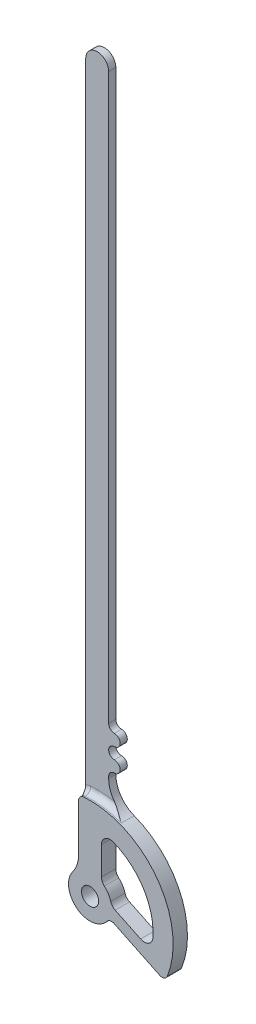
ISO-10303-21;
HEADER;
FILE_DESCRIPTION(('STEP AP214'),'2;1');
FILE_NAME('part.step','',(''),(''),'','','');
FILE_SCHEMA(('AUTOMOTIVE_DESIGN { 1 0 10303 214 1 1 1 1 }'));
ENDSEC;
DATA;
#1=APPLICATION_CONTEXT('core data for automotive mechanical design processes');
#2=APPLICATION_PROTOCOL_DEFINITION('international standard','automotive_design',2000,#1);
#3=PRODUCT_CONTEXT('',#1,'mechanical');
#4=PRODUCT('Part','Part','',(#3));
#5=PRODUCT_RELATED_PRODUCT_CATEGORY('part','',(#4));
#6=PRODUCT_DEFINITION_FORMATION('','',#4);
#7=PRODUCT_DEFINITION_CONTEXT('part definition',#1,'design');
#8=PRODUCT_DEFINITION('design','',#6,#7);
#9=PRODUCT_DEFINITION_SHAPE('','',#8);
#10=(LENGTH_UNIT() NAMED_UNIT(*) SI_UNIT(.MILLI.,.METRE.));
#11=(NAMED_UNIT(*) PLANE_ANGLE_UNIT() SI_UNIT($,.RADIAN.));
#12=(NAMED_UNIT(*) SI_UNIT($,.STERADIAN.) SOLID_ANGLE_UNIT());
#13=UNCERTAINTY_MEASURE_WITH_UNIT(LENGTH_MEASURE(1.E-05),#10,'distance_accuracy_value','');
#14=(GEOMETRIC_REPRESENTATION_CONTEXT(3) GLOBAL_UNCERTAINTY_ASSIGNED_CONTEXT((#13)) GLOBAL_UNIT_ASSIGNED_CONTEXT((#10,
#11,#12)) REPRESENTATION_CONTEXT('',''));
#15=CARTESIAN_POINT('',(0.,0.,0.));
#16=DIRECTION('',(0.,0.,1.));
#17=DIRECTION('',(1.,0.,0.));
#18=AXIS2_PLACEMENT_3D('',#15,#16,#17);
#19=CARTESIAN_POINT('',(4.,0.,247.784889177542));
#20=DIRECTION('',(1.,0.,0.));
#21=DIRECTION('',(0.,0.,1.));
#22=AXIS2_PLACEMENT_3D('',#19,#20,#21);
#23=PLANE('',#22);
#24=DIRECTION('',(0.,-1.,0.));
#25=VECTOR('',#24,1.);
#26=CARTESIAN_POINT('',(4.,0.,-2.5));
#27=LINE('',#26,#25);
#28=CARTESIAN_POINT('',(4.,37.,-2.5));
#29=VERTEX_POINT('',#28);
#30=CARTESIAN_POINT('',(4.,36.4005494464036,-2.5));
#31=VERTEX_POINT('',#30);
#32=EDGE_CURVE('E241',#29,#31,#27,.T.);
#33=ORIENTED_EDGE('',*,*,#32,.T.);
#34=DIRECTION('',(0.,0.,1.));
#35=VECTOR('',#34,1.);
#36=CARTESIAN_POINT('',(4.,36.4005494464036,247.784889177542));
#37=LINE('',#36,#35);
#38=CARTESIAN_POINT('',(4.,36.4005494464036,-5.));
#39=VERTEX_POINT('',#38);
#40=EDGE_CURVE('E344',#39,#31,#37,.T.);
#41=ORIENTED_EDGE('',*,*,#40,.F.);
#42=DIRECTION('',(0.,1.,0.));
#43=VECTOR('',#42,1.);
#44=CARTESIAN_POINT('',(4.,0.,-5.));
#45=LINE('',#44,#43);
#46=CARTESIAN_POINT('',(4.,37.,-5.));
#47=VERTEX_POINT('',#46);
#48=EDGE_CURVE('E285',#39,#47,#45,.T.);
#49=ORIENTED_EDGE('',*,*,#48,.T.);
#50=DIRECTION('',(0.,0.,-1.));
#51=VECTOR('',#50,1.);
#52=CARTESIAN_POINT('',(4.,37.,247.784889177542));
#53=LINE('',#52,#51);
#54=EDGE_CURVE('E871',#29,#47,#53,.T.);
#55=ORIENTED_EDGE('',*,*,#54,.F.);
#56=EDGE_LOOP('',(#33,#41,#49,#55));
#57=FACE_BOUND('',#56,.T.);
#58=ADVANCED_FACE('F45',(#57),#23,.T.);
#59=CARTESIAN_POINT('',(4.,53.,-5.));
#60=VERTEX_POINT('',#59);
#61=CARTESIAN_POINT('',(4.,250.,-5.));
#62=VERTEX_POINT('',#61);
#63=EDGE_CURVE('E269',#60,#62,#45,.T.);
#64=ORIENTED_EDGE('',*,*,#63,.T.);
#65=DIRECTION('',(0.,0.,-1.));
#66=VECTOR('',#65,1.);
#67=CARTESIAN_POINT('',(4.,250.,247.784889177542));
#68=LINE('',#67,#66);
#69=CARTESIAN_POINT('',(4.,250.,-2.5));
#70=VERTEX_POINT('',#69);
#71=EDGE_CURVE('E293',#70,#62,#68,.T.);
#72=ORIENTED_EDGE('',*,*,#71,.F.);
#73=CARTESIAN_POINT('',(4.,53.,-2.5));
#74=VERTEX_POINT('',#73);
#75=EDGE_CURVE('E247',#70,#74,#27,.T.);
#76=ORIENTED_EDGE('',*,*,#75,.T.);
#77=DIRECTION('',(0.,0.,-1.));
#78=VECTOR('',#77,1.);
#79=CARTESIAN_POINT('',(4.,53.,247.784889177542));
#80=LINE('',#79,#78);
#81=EDGE_CURVE('E826',#60,#74,#80,.F.);
#82=ORIENTED_EDGE('',*,*,#81,.F.);
#83=EDGE_LOOP('',(#64,#72,#76,#82));
#84=FACE_BOUND('',#83,.T.);
#85=ADVANCED_FACE('F451',(#84),#23,.T.);
#86=CARTESIAN_POINT('',(2.69287587756797E-12,0.,0.));
#87=DIRECTION('',(0.,0.,-1.));
#88=DIRECTION('',(1.,0.,0.));
#89=AXIS2_PLACEMENT_3D('',#86,#87,#88);
#90=PLANE('',#89);
#91=CARTESIAN_POINT('',(0.,0.,0.));
#92=DIRECTION('',(0.,0.,1.));
#93=DIRECTION('',(1.,0.,0.));
#94=AXIS2_PLACEMENT_3D('',#91,#92,#93);
#95=CIRCLE('',#94,7.5);
#96=CARTESIAN_POINT('',(7.20644694761719,2.07776860867107,0.));
#97=VERTEX_POINT('',#96);
#98=CARTESIAN_POINT('',(5.,5.59016994374947,0.));
#99=VERTEX_POINT('',#98);
#100=EDGE_CURVE('E266',#97,#99,#95,.T.);
#101=ORIENTED_EDGE('',*,*,#100,.T.);
#102=CARTESIAN_POINT('',(7.,7.82623792124926,0.));
#103=DIRECTION('',(0.,0.,1.));
#104=DIRECTION('',(1.,0.,0.));
#105=AXIS2_PLACEMENT_3D('',#102,#103,#104);
#106=CIRCLE('',#105,3.);
#107=CARTESIAN_POINT('',(4.,7.82623792124926,0.));
#108=VERTEX_POINT('',#107);
#109=EDGE_CURVE('E376',#108,#99,#106,.T.);
#110=ORIENTED_EDGE('',*,*,#109,.F.);
#111=DIRECTION('',(0.,1.,0.));
#112=VECTOR('',#111,1.);
#113=CARTESIAN_POINT('',(4.,0.,0.));
#114=LINE('',#113,#112);
#115=CARTESIAN_POINT('',(4.,17.6635217326557,0.));
#116=VERTEX_POINT('',#115);
#117=EDGE_CURVE('E263',#108,#116,#114,.T.);
#118=ORIENTED_EDGE('',*,*,#117,.T.);
#119=CARTESIAN_POINT('',(7.,17.6635217326557,0.));
#120=DIRECTION('',(0.,0.,1.));
#121=DIRECTION('',(1.,0.,0.));
#122=AXIS2_PLACEMENT_3D('',#119,#120,#121);
#123=CIRCLE('',#122,3.);
#124=CARTESIAN_POINT('',(8.10526315789474,20.4524988483382,0.));
#125=VERTEX_POINT('',#124);
#126=EDGE_CURVE('E394',#125,#116,#123,.T.);
#127=ORIENTED_EDGE('',*,*,#126,.F.);
#128=CARTESIAN_POINT('',(0.,0.,0.));
#129=DIRECTION('',(0.,0.,1.));
#130=DIRECTION('',(1.,0.,0.));
#131=AXIS2_PLACEMENT_3D('',#128,#129,#130);
#132=CIRCLE('',#131,22.);
#133=CARTESIAN_POINT('',(21.9434589485245,-1.57626437326332,0.));
#134=VERTEX_POINT('',#133);
#135=EDGE_CURVE('E259',#134,#125,#132,.T.);
#136=ORIENTED_EDGE('',*,*,#135,.F.);
#137=CARTESIAN_POINT('',(18.9511690919075,-1.36131923145469,0.));
#138=DIRECTION('',(0.,0.,1.));
#139=DIRECTION('',(1.,0.,0.));
#140=AXIS2_PLACEMENT_3D('',#137,#138,#139);
#141=CIRCLE('',#140,3.);
#142=CARTESIAN_POINT('',(17.6489208192768,-4.06393822724936,0.));
#143=VERTEX_POINT('',#142);
#144=EDGE_CURVE('E382',#143,#134,#141,.T.);
#145=ORIENTED_EDGE('',*,*,#144,.F.);
#146=DIRECTION('',(0.900872998598224,-0.434082757543587,0.));
#147=VECTOR('',#146,1.);
#148=CARTESIAN_POINT('',(1.73633103017435,3.6034919943929,0.));
#149=LINE('',#148,#147);
#150=CARTESIAN_POINT('',(8.7867774540333,0.206257056344831,0.));
#151=VERTEX_POINT('',#150);
#152=EDGE_CURVE('E256',#151,#143,#149,.T.);
#153=ORIENTED_EDGE('',*,*,#152,.F.);
#154=CARTESIAN_POINT('',(10.0890257266641,2.9088760521395,0.));
#155=DIRECTION('',(0.,0.,1.));
#156=DIRECTION('',(1.,0.,0.));
#157=AXIS2_PLACEMENT_3D('',#154,#155,#156);
#158=CIRCLE('',#157,3.);
#159=EDGE_CURVE('E388',#97,#151,#158,.T.);
#160=ORIENTED_EDGE('',*,*,#159,.F.);
#161=EDGE_LOOP('',(#101,#110,#118,#127,#136,#145,#153,#160));
#162=FACE_BOUND('',#161,.T.);
#163=CARTESIAN_POINT('',(2.69287587756797E-12,0.,0.));
#164=DIRECTION('',(0.,0.,1.));
#165=DIRECTION('',(1.,0.,0.));
#166=AXIS2_PLACEMENT_3D('',#163,#164,#165);
#167=CIRCLE('',#166,2.99999999999804);
#168=CARTESIAN_POINT('',(3.00000000000073,0.,0.));
#169=VERTEX_POINT('',#168);
#170=EDGE_CURVE('E283',#169,#169,#167,.T.);
#171=ORIENTED_EDGE('',*,*,#170,.F.);
#172=EDGE_LOOP('',(#171));
#173=FACE_BOUND('',#172,.T.);
#174=DIRECTION('',(0.,-1.,0.));
#175=VECTOR('',#174,1.);
#176=CARTESIAN_POINT('',(-4.,0.,0.));
#177=LINE('',#176,#175);
#178=CARTESIAN_POINT('',(-4.,26.9258240356723,0.));
#179=VERTEX_POINT('',#178);
#180=CARTESIAN_POINT('',(-4.,10.4999999999964,0.));
#181=VERTEX_POINT('',#180);
#182=EDGE_CURVE('E280',#179,#181,#177,.T.);
#183=ORIENTED_EDGE('',*,*,#182,.T.);
#184=CARTESIAN_POINT('',(-14.,10.4999999999964,0.));
#185=DIRECTION('',(0.,0.,1.));
#186=DIRECTION('',(1.,0.,0.));
#187=AXIS2_PLACEMENT_3D('',#184,#185,#186);
#188=CIRCLE('',#187,10.);
#189=CARTESIAN_POINT('',(-5.99999999999846,4.49999999999846,0.));
#190=VERTEX_POINT('',#189);
#191=EDGE_CURVE('E354',#190,#181,#188,.T.);
#192=ORIENTED_EDGE('',*,*,#191,.F.);
#193=CARTESIAN_POINT('',(2.69287587756797E-12,0.,0.));
#194=DIRECTION('',(0.,0.,1.));
#195=DIRECTION('',(1.,0.,0.));
#196=AXIS2_PLACEMENT_3D('',#193,#194,#195);
#197=CIRCLE('',#196,7.5);
#198=CARTESIAN_POINT('',(5.91972720711249,-4.60508738173382,0.));
#199=VERTEX_POINT('',#198);
#200=EDGE_CURVE('E301',#190,#199,#197,.T.);
#201=ORIENTED_EDGE('',*,*,#200,.T.);
#202=CARTESIAN_POINT('',(7.49832112900844,-5.8331106835295,0.));
#203=DIRECTION('',(0.,0.,1.));
#204=DIRECTION('',(1.,0.,0.));
#205=AXIS2_PLACEMENT_3D('',#202,#203,#204);
#206=CIRCLE('',#205,2.);
#207=CARTESIAN_POINT('',(8.36648664409569,-4.03136468633309,0.));
#208=VERTEX_POINT('',#207);
#209=EDGE_CURVE('E335',#208,#199,#206,.T.);
#210=ORIENTED_EDGE('',*,*,#209,.F.);
#211=DIRECTION('',(0.900872998598205,-0.434082757543626,0.));
#212=VECTOR('',#211,1.);
#213=CARTESIAN_POINT('',(6.75654748948923,-3.25562068157719,0.));
#214=LINE('',#213,#212);
#215=CARTESIAN_POINT('',(24.2567478387466,-11.6880359465392,0.));
#216=VERTEX_POINT('',#215);
#217=EDGE_CURVE('E316',#208,#216,#214,.T.);
#218=ORIENTED_EDGE('',*,*,#217,.T.);
#219=CARTESIAN_POINT('',(25.1249133538339,-9.88628994934276,0.));
#220=DIRECTION('',(0.,0.,1.));
#221=DIRECTION('',(1.,0.,0.));
#222=AXIS2_PLACEMENT_3D('',#219,#220,#221);
#223=CIRCLE('',#222,2.);
#224=CARTESIAN_POINT('',(26.9860180467103,-10.6186077233681,0.));
#225=VERTEX_POINT('',#224);
#226=EDGE_CURVE('E329',#225,#216,#223,.F.);
#227=ORIENTED_EDGE('',*,*,#226,.F.);
#228=CARTESIAN_POINT('',(2.69287587756797E-12,0.,0.));
#229=DIRECTION('',(0.,0.,1.));
#230=DIRECTION('',(1.,0.,0.));
#231=AXIS2_PLACEMENT_3D('',#228,#229,#230);
#232=CIRCLE('',#231,29.);
#233=CARTESIAN_POINT('',(-2.14814814814835,28.9203295197962,0.));
#234=VERTEX_POINT('',#233);
#235=EDGE_CURVE('E308',#225,#234,#232,.T.);
#236=ORIENTED_EDGE('',*,*,#235,.T.);
#237=CARTESIAN_POINT('',(-2.,26.9258240356723,0.));
#238=DIRECTION('',(0.,0.,1.));
#239=DIRECTION('',(1.,0.,0.));
#240=AXIS2_PLACEMENT_3D('',#237,#238,#239);
#241=CIRCLE('',#240,2.);
#242=EDGE_CURVE('E399',#179,#234,#241,.F.);
#243=ORIENTED_EDGE('',*,*,#242,.F.);
#244=EDGE_LOOP('',(#183,#192,#201,#210,#218,#227,#236,#243));
#245=FACE_BOUND('',#244,.T.);
#246=ADVANCED_FACE('F449',(#162,#173,#245),#90,.F.);
#247=CARTESIAN_POINT('',(0.,250.,247.784889177542));
#248=DIRECTION('',(0.,0.,-1.));
#249=DIRECTION('',(1.,0.,0.));
#250=AXIS2_PLACEMENT_3D('',#247,#248,#249);
#251=CYLINDRICAL_SURFACE('',#250,4.);
#252=ORIENTED_EDGE('',*,*,#71,.T.);
#253=CARTESIAN_POINT('',(0.,250.,-5.));
#254=DIRECTION('',(0.,0.,1.));
#255=DIRECTION('',(1.,0.,0.));
#256=AXIS2_PLACEMENT_3D('',#253,#254,#255);
#257=CIRCLE('',#256,4.);
#258=CARTESIAN_POINT('',(-4.,250.,-5.));
#259=VERTEX_POINT('',#258);
#260=EDGE_CURVE('E288',#62,#259,#257,.T.);
#261=ORIENTED_EDGE('',*,*,#260,.T.);
#262=DIRECTION('',(0.,0.,-1.));
#263=VECTOR('',#262,1.);
#264=CARTESIAN_POINT('',(-4.,250.,247.784889177542));
#265=LINE('',#264,#263);
#266=CARTESIAN_POINT('',(-4.,250.,-2.5));
#267=VERTEX_POINT('',#266);
#268=EDGE_CURVE('E284',#267,#259,#265,.T.);
#269=ORIENTED_EDGE('',*,*,#268,.F.);
#270=CARTESIAN_POINT('',(0.,250.,-2.5));
#271=DIRECTION('',(0.,0.,-1.));
#272=DIRECTION('',(-1.,0.,0.));
#273=AXIS2_PLACEMENT_3D('',#270,#271,#272);
#274=CIRCLE('',#273,4.);
#275=EDGE_CURVE('E248',#267,#70,#274,.T.);
#276=ORIENTED_EDGE('',*,*,#275,.T.);
#277=EDGE_LOOP('',(#252,#261,#269,#276));
#278=FACE_BOUND('',#277,.T.);
#279=ADVANCED_FACE('F445',(#278),#251,.T.);
#280=CARTESIAN_POINT('',(14.,36.4005494464036,-5.));
#281=DIRECTION('',(0.,0.,1.));
#282=DIRECTION('',(-1.,0.,0.));
#283=AXIS2_PLACEMENT_3D('',#280,#281,#282);
#284=CYLINDRICAL_SURFACE('',#283,10.);
#285=CARTESIAN_POINT('',(14.,36.4005494464036,-2.5));
#286=DIRECTION('',(0.,0.,-1.));
#287=DIRECTION('',(-1.,0.,0.));
#288=AXIS2_PLACEMENT_3D('',#285,#286,#287);
#289=CIRCLE('',#288,10.);
#290=CARTESIAN_POINT('',(5.98835494559473,30.4161076577133,-2.5));
#291=VERTEX_POINT('',#290);
#292=EDGE_CURVE('E243',#31,#291,#289,.F.);
#293=ORIENTED_EDGE('',*,*,#292,.T.);
#294=CARTESIAN_POINT('',(5.98835494559472,30.4161076577133,-2.5));
#295=CARTESIAN_POINT('',(6.06925405762394,30.3077742408171,-2.49995190357718));
#296=CARTESIAN_POINT('',(6.15228611807816,30.2012260528204,-2.49384101835242));
#297=CARTESIAN_POINT('',(6.32184825433212,29.9924346777865,-2.47123797254335));
#298=CARTESIAN_POINT('',(6.40837057256933,29.8901828744651,-2.45476776281015));
#299=CARTESIAN_POINT('',(6.58370940894421,29.691145314492,-2.41336042817435));
#300=CARTESIAN_POINT('',(6.67249870460525,29.5943190563328,-2.3884998506774));
#301=CARTESIAN_POINT('',(6.85274752973702,29.4052761709589,-2.33160605976266));
#302=CARTESIAN_POINT('',(6.9442088868756,29.313062821679,-2.29956783204339));
#303=CARTESIAN_POINT('',(7.19646405991991,29.0683353698712,-2.20413386144462));
#304=CARTESIAN_POINT('',(7.35954262184815,28.9204648547703,-2.13482182792853));
#305=CARTESIAN_POINT('',(7.69139801420434,28.6385258619691,-1.98308128976261));
#306=CARTESIAN_POINT('',(7.86017780672204,28.5044647101085,-1.90064588161173));
#307=CARTESIAN_POINT('',(8.2036039528961,28.2489958741337,-1.7257627779787));
#308=CARTESIAN_POINT('',(8.37827618873322,28.1276574077541,-1.63326538149455));
#309=CARTESIAN_POINT('',(8.73219253245133,27.8979203744389,-1.44148728812823));
#310=CARTESIAN_POINT('',(8.91143517435556,27.7895177201088,-1.3422087495917));
#311=CARTESIAN_POINT('',(9.30428585534102,27.5682710213277,-1.12243449354019));
#312=CARTESIAN_POINT('',(9.51868918577539,27.4576392339267,-1.00113852639561));
#313=CARTESIAN_POINT('',(9.95305788991437,27.2528846986253,-0.755868891533057));
#314=CARTESIAN_POINT('',(10.1730102284988,27.1587267560106,-0.631901583824298));
#315=CARTESIAN_POINT('',(10.4007315485907,27.0707427734298,-0.505293313316028));
#316=CARTESIAN_POINT('',(10.4054932936564,27.0689071754453,-0.50264664819935));
#317=CARTESIAN_POINT('',(10.4102564102571,27.0670752293771,-0.5));
#318=B_SPLINE_CURVE_WITH_KNOTS('',3,(#294,#295,#296,#297,#298,#299,#300,#301,#302,#303,#304,
#305,#306,#307,#308,#309,#310,#311,#312,#313,#314,#315,#316,#317),.UNSPECIFIED.,.F.,.F.,(4,2,2,
2,2,2,2,2,2,2,2,4),(0.,0.405235878062857,0.809615962602358,1.21040226899694,1.61146944237907,
2.30271912013183,2.9943336360746,3.689534437942,4.38451498873265,5.19403024713252,
6.00179435939041,6.01904069334347),.UNSPECIFIED.);
#319=CARTESIAN_POINT('',(10.4102564102571,27.0670752293771,-0.5));
#320=VERTEX_POINT('',#319);
#321=EDGE_CURVE('E424',#320,#291,#318,.F.);
#322=ORIENTED_EDGE('',*,*,#321,.F.);
#323=DIRECTION('',(0.,0.,1.));
#324=VECTOR('',#323,1.);
#325=CARTESIAN_POINT('',(10.4102564102571,27.0670752293771,-5.));
#326=LINE('',#325,#324);
#327=CARTESIAN_POINT('',(10.4102564102571,27.0670752293771,-5.));
#328=VERTEX_POINT('',#327);
#329=EDGE_CURVE('E341',#320,#328,#326,.F.);
#330=ORIENTED_EDGE('',*,*,#329,.T.);
#331=CARTESIAN_POINT('',(14.,36.4005494464036,-5.));
#332=DIRECTION('',(0.,0.,1.));
#333=DIRECTION('',(1.,0.,0.));
#334=AXIS2_PLACEMENT_3D('',#331,#332,#333);
#335=CIRCLE('',#334,10.);
#336=EDGE_CURVE('E350',#328,#39,#335,.F.);
#337=ORIENTED_EDGE('',*,*,#336,.T.);
#338=ORIENTED_EDGE('',*,*,#40,.T.);
#339=EDGE_LOOP('',(#293,#322,#330,#337,#338));
#340=FACE_BOUND('',#339,.T.);
#341=ADVANCED_FACE('F448',(#340),#284,.F.);
#342=CARTESIAN_POINT('',(2.69287587756797E-12,0.,-5.));
#343=DIRECTION('',(0.,0.,1.));
#344=DIRECTION('',(-1.,0.,0.));
#345=AXIS2_PLACEMENT_3D('',#342,#343,#344);
#346=CYLINDRICAL_SURFACE('',#345,7.5);
#347=CARTESIAN_POINT('',(2.69287587756797E-12,0.,-5.));
#348=DIRECTION('',(0.,0.,1.));
#349=DIRECTION('',(1.,0.,0.));
#350=AXIS2_PLACEMENT_3D('',#347,#348,#349);
#351=CIRCLE('',#350,7.5);
#352=CARTESIAN_POINT('',(-5.99999999999846,4.49999999999846,-5.));
#353=VERTEX_POINT('',#352);
#354=CARTESIAN_POINT('',(5.91972720711249,-4.60508738173382,-5.));
#355=VERTEX_POINT('',#354);
#356=EDGE_CURVE('E304',#353,#355,#351,.T.);
#357=ORIENTED_EDGE('',*,*,#356,.T.);
#358=DIRECTION('',(0.,0.,1.));
#359=VECTOR('',#358,1.);
#360=CARTESIAN_POINT('',(5.91972720711249,-4.60508738173382,-5.));
#361=LINE('',#360,#359);
#362=EDGE_CURVE('E324',#199,#355,#361,.F.);
#363=ORIENTED_EDGE('',*,*,#362,.F.);
#364=ORIENTED_EDGE('',*,*,#200,.F.);
#365=DIRECTION('',(0.,0.,1.));
#366=VECTOR('',#365,1.);
#367=CARTESIAN_POINT('',(-5.99999999999846,4.49999999999846,-5.));
#368=LINE('',#367,#366);
#369=EDGE_CURVE('E348',#353,#190,#368,.T.);
#370=ORIENTED_EDGE('',*,*,#369,.F.);
#371=EDGE_LOOP('',(#357,#363,#364,#370));
#372=FACE_BOUND('',#371,.T.);
#373=ADVANCED_FACE('F463',(#372),#346,.T.);
#374=CARTESIAN_POINT('',(2.69287587756797E-12,0.,-5.));
#375=DIRECTION('',(0.,0.,-1.));
#376=DIRECTION('',(1.,0.,0.));
#377=AXIS2_PLACEMENT_3D('',#374,#375,#376);
#378=PLANE('',#377);
#379=DIRECTION('',(0.900872998598224,-0.434082757543587,0.));
#380=VECTOR('',#379,1.);
#381=CARTESIAN_POINT('',(1.73633103017435,3.6034919943929,-5.));
#382=LINE('',#381,#380);
#383=CARTESIAN_POINT('',(8.7867774540333,0.206257056344831,-5.));
#384=VERTEX_POINT('',#383);
#385=CARTESIAN_POINT('',(17.6489208192768,-4.06393822724936,-5.));
#386=VERTEX_POINT('',#385);
#387=EDGE_CURVE('E251',#384,#386,#382,.T.);
#388=ORIENTED_EDGE('',*,*,#387,.T.);
#389=CARTESIAN_POINT('',(18.9511690919075,-1.36131923145469,-5.));
#390=DIRECTION('',(0.,0.,1.));
#391=DIRECTION('',(1.,0.,0.));
#392=AXIS2_PLACEMENT_3D('',#389,#390,#391);
#393=CIRCLE('',#392,3.);
#394=CARTESIAN_POINT('',(21.9434589485245,-1.57626437326332,-5.));
#395=VERTEX_POINT('',#394);
#396=EDGE_CURVE('E379',#395,#386,#393,.F.);
#397=ORIENTED_EDGE('',*,*,#396,.F.);
#398=CARTESIAN_POINT('',(0.,0.,-5.));
#399=DIRECTION('',(0.,0.,1.));
#400=DIRECTION('',(1.,0.,0.));
#401=AXIS2_PLACEMENT_3D('',#398,#399,#400);
#402=CIRCLE('',#401,22.);
#403=CARTESIAN_POINT('',(8.10526315789474,20.4524988483382,-5.));
#404=VERTEX_POINT('',#403);
#405=EDGE_CURVE('E272',#395,#404,#402,.T.);
#406=ORIENTED_EDGE('',*,*,#405,.T.);
#407=CARTESIAN_POINT('',(7.,17.6635217326557,-5.));
#408=DIRECTION('',(0.,0.,1.));
#409=DIRECTION('',(1.,0.,0.));
#410=AXIS2_PLACEMENT_3D('',#407,#408,#409);
#411=CIRCLE('',#410,3.);
#412=CARTESIAN_POINT('',(4.,17.6635217326557,-5.));
#413=VERTEX_POINT('',#412);
#414=EDGE_CURVE('E391',#413,#404,#411,.F.);
#415=ORIENTED_EDGE('',*,*,#414,.F.);
#416=DIRECTION('',(0.,1.,0.));
#417=VECTOR('',#416,1.);
#418=CARTESIAN_POINT('',(4.,0.,-5.));
#419=LINE('',#418,#417);
#420=CARTESIAN_POINT('',(4.,7.82623792124926,-5.));
#421=VERTEX_POINT('',#420);
#422=EDGE_CURVE('E275',#421,#413,#419,.T.);
#423=ORIENTED_EDGE('',*,*,#422,.F.);
#424=CARTESIAN_POINT('',(7.,7.82623792124926,-5.));
#425=DIRECTION('',(0.,0.,1.));
#426=DIRECTION('',(1.,0.,0.));
#427=AXIS2_PLACEMENT_3D('',#424,#425,#426);
#428=CIRCLE('',#427,3.);
#429=CARTESIAN_POINT('',(5.,5.59016994374947,-5.));
#430=VERTEX_POINT('',#429);
#431=EDGE_CURVE('E373',#430,#421,#428,.F.);
#432=ORIENTED_EDGE('',*,*,#431,.F.);
#433=CARTESIAN_POINT('',(0.,0.,-5.));
#434=DIRECTION('',(0.,0.,1.));
#435=DIRECTION('',(1.,0.,0.));
#436=AXIS2_PLACEMENT_3D('',#433,#434,#435);
#437=CIRCLE('',#436,7.5);
#438=CARTESIAN_POINT('',(7.20644694761719,2.07776860867107,-5.));
#439=VERTEX_POINT('',#438);
#440=EDGE_CURVE('E260',#439,#430,#437,.T.);
#441=ORIENTED_EDGE('',*,*,#440,.F.);
#442=CARTESIAN_POINT('',(10.0890257266641,2.9088760521395,-5.));
#443=DIRECTION('',(0.,0.,1.));
#444=DIRECTION('',(1.,0.,0.));
#445=AXIS2_PLACEMENT_3D('',#442,#443,#444);
#446=CIRCLE('',#445,3.);
#447=EDGE_CURVE('E385',#384,#439,#446,.F.);
#448=ORIENTED_EDGE('',*,*,#447,.F.);
#449=EDGE_LOOP('',(#388,#397,#406,#415,#423,#432,#441,#448));
#450=FACE_BOUND('',#449,.T.);
#451=DIRECTION('',(0.900872998598205,-0.434082757543626,0.));
#452=VECTOR('',#451,1.);
#453=CARTESIAN_POINT('',(6.75654748948923,-3.25562068157719,-5.));
#454=LINE('',#453,#452);
#455=CARTESIAN_POINT('',(8.36648664409569,-4.03136468633309,-5.));
#456=VERTEX_POINT('',#455);
#457=CARTESIAN_POINT('',(24.2567478387466,-11.6880359465392,-5.));
#458=VERTEX_POINT('',#457);
#459=EDGE_CURVE('E307',#456,#458,#454,.T.);
#460=ORIENTED_EDGE('',*,*,#459,.F.);
#461=CARTESIAN_POINT('',(7.49832112900844,-5.8331106835295,-5.));
#462=DIRECTION('',(0.,0.,1.));
#463=DIRECTION('',(1.,0.,0.));
#464=AXIS2_PLACEMENT_3D('',#461,#462,#463);
#465=CIRCLE('',#464,2.);
#466=EDGE_CURVE('E338',#355,#456,#465,.F.);
#467=ORIENTED_EDGE('',*,*,#466,.F.);
#468=ORIENTED_EDGE('',*,*,#356,.F.);
#469=CARTESIAN_POINT('',(-14.,10.4999999999964,-5.));
#470=DIRECTION('',(0.,0.,1.));
#471=DIRECTION('',(1.,0.,0.));
#472=AXIS2_PLACEMENT_3D('',#469,#470,#471);
#473=CIRCLE('',#472,10.);
#474=CARTESIAN_POINT('',(-4.,10.4999999999964,-5.));
#475=VERTEX_POINT('',#474);
#476=EDGE_CURVE('E352',#475,#353,#473,.F.);
#477=ORIENTED_EDGE('',*,*,#476,.F.);
#478=DIRECTION('',(0.,1.,0.));
#479=VECTOR('',#478,1.);
#480=CARTESIAN_POINT('',(-4.,0.,-5.));
#481=LINE('',#480,#479);
#482=EDGE_CURVE('E291',#475,#259,#481,.T.);
#483=ORIENTED_EDGE('',*,*,#482,.T.);
#484=ORIENTED_EDGE('',*,*,#260,.F.);
#485=ORIENTED_EDGE('',*,*,#63,.F.);
#486=CARTESIAN_POINT('',(6.,53.,-5.));
#487=DIRECTION('',(0.,0.,1.));
#488=DIRECTION('',(1.,0.,0.));
#489=AXIS2_PLACEMENT_3D('',#486,#487,#488);
#490=CIRCLE('',#489,2.);
#491=CARTESIAN_POINT('',(6.00000000000001,51.,-5.));
#492=VERTEX_POINT('',#491);
#493=EDGE_CURVE('E828',#492,#60,#490,.F.);
#494=ORIENTED_EDGE('',*,*,#493,.F.);
#495=CARTESIAN_POINT('',(6.00000000000001,49.,-5.));
#496=DIRECTION('',(0.,0.,1.));
#497=DIRECTION('',(1.,0.,0.));
#498=AXIS2_PLACEMENT_3D('',#495,#496,#497);
#499=CIRCLE('',#498,2.);
#500=CARTESIAN_POINT('',(6.00000000000001,47.,-5.));
#501=VERTEX_POINT('',#500);
#502=EDGE_CURVE('E832',#501,#492,#499,.T.);
#503=ORIENTED_EDGE('',*,*,#502,.F.);
#504=CARTESIAN_POINT('',(6.00000000000001,45.,-5.));
#505=DIRECTION('',(0.,0.,1.));
#506=DIRECTION('',(1.,0.,0.));
#507=AXIS2_PLACEMENT_3D('',#504,#505,#506);
#508=CIRCLE('',#507,2.);
#509=CARTESIAN_POINT('',(6.00000000000001,43.,-5.));
#510=VERTEX_POINT('',#509);
#511=EDGE_CURVE('E839',#501,#510,#508,.T.);
#512=ORIENTED_EDGE('',*,*,#511,.T.);
#513=CARTESIAN_POINT('',(6.00000000000001,41.,-5.));
#514=DIRECTION('',(0.,0.,1.));
#515=DIRECTION('',(1.,0.,0.));
#516=AXIS2_PLACEMENT_3D('',#513,#514,#515);
#517=CIRCLE('',#516,2.);
#518=CARTESIAN_POINT('',(6.00000000000001,39.,-5.));
#519=VERTEX_POINT('',#518);
#520=EDGE_CURVE('E236',#519,#510,#517,.T.);
#521=ORIENTED_EDGE('',*,*,#520,.F.);
#522=CARTESIAN_POINT('',(6.,37.,-5.));
#523=DIRECTION('',(0.,0.,1.));
#524=DIRECTION('',(1.,0.,0.));
#525=AXIS2_PLACEMENT_3D('',#522,#523,#524);
#526=CIRCLE('',#525,2.);
#527=EDGE_CURVE('E53',#47,#519,#526,.F.);
#528=ORIENTED_EDGE('',*,*,#527,.F.);
#529=ORIENTED_EDGE('',*,*,#48,.F.);
#530=ORIENTED_EDGE('',*,*,#336,.F.);
#531=CARTESIAN_POINT('',(2.69287587756797E-12,0.,-5.));
#532=DIRECTION('',(0.,0.,1.));
#533=DIRECTION('',(1.,0.,0.));
#534=AXIS2_PLACEMENT_3D('',#531,#532,#533);
#535=CIRCLE('',#534,29.);
#536=CARTESIAN_POINT('',(26.9860180467103,-10.6186077233681,-5.));
#537=VERTEX_POINT('',#536);
#538=EDGE_CURVE('E311',#537,#328,#535,.T.);
#539=ORIENTED_EDGE('',*,*,#538,.F.);
#540=CARTESIAN_POINT('',(25.1249133538339,-9.88628994934276,-5.));
#541=DIRECTION('',(0.,0.,1.));
#542=DIRECTION('',(1.,0.,0.));
#543=AXIS2_PLACEMENT_3D('',#540,#541,#542);
#544=CIRCLE('',#543,2.);
#545=EDGE_CURVE('E332',#458,#537,#544,.T.);
#546=ORIENTED_EDGE('',*,*,#545,.F.);
#547=EDGE_LOOP('',(#460,#467,#468,#477,#483,#484,#485,#494,#503,#512,#521,#528,#529,#530,#539,#546));
#548=FACE_BOUND('',#547,.T.);
#549=CARTESIAN_POINT('',(2.69287587756797E-12,0.,-5.));
#550=DIRECTION('',(0.,0.,1.));
#551=DIRECTION('',(1.,0.,0.));
#552=AXIS2_PLACEMENT_3D('',#549,#550,#551);
#553=CIRCLE('',#552,2.99999999999804);
#554=CARTESIAN_POINT('',(3.00000000000073,0.,-5.));
#555=VERTEX_POINT('',#554);
#556=EDGE_CURVE('E298',#555,#555,#553,.T.);
#557=ORIENTED_EDGE('',*,*,#556,.T.);
#558=EDGE_LOOP('',(#557));
#559=FACE_BOUND('',#558,.T.);
#560=ADVANCED_FACE('F459',(#450,#548,#559),#378,.T.);
#561=CARTESIAN_POINT('',(6.75654748948923,-3.25562068157719,-5.));
#562=DIRECTION('',(0.434082757543626,0.900872998598205,0.));
#563=DIRECTION('',(-0.900872998598205,0.434082757543626,0.));
#564=AXIS2_PLACEMENT_3D('',#561,#562,#563);
#565=PLANE('',#564);
#566=ORIENTED_EDGE('',*,*,#459,.T.);
#567=DIRECTION('',(0.,0.,1.));
#568=VECTOR('',#567,1.);
#569=CARTESIAN_POINT('',(24.2567478387466,-11.6880359465392,-5.));
#570=LINE('',#569,#568);
#571=EDGE_CURVE('E313',#216,#458,#570,.F.);
#572=ORIENTED_EDGE('',*,*,#571,.F.);
#573=ORIENTED_EDGE('',*,*,#217,.F.);
#574=DIRECTION('',(0.,0.,-1.));
#575=VECTOR('',#574,1.);
#576=CARTESIAN_POINT('',(8.36648664409569,-4.03136468633309,0.));
#577=LINE('',#576,#575);
#578=EDGE_CURVE('E322',#456,#208,#577,.F.);
#579=ORIENTED_EDGE('',*,*,#578,.F.);
#580=EDGE_LOOP('',(#566,#572,#573,#579));
#581=FACE_BOUND('',#580,.T.);
#582=ADVANCED_FACE('F462',(#581),#565,.F.);
#583=CARTESIAN_POINT('',(2.69287587756797E-12,0.,-5.));
#584=DIRECTION('',(0.,0.,1.));
#585=DIRECTION('',(-1.,0.,0.));
#586=AXIS2_PLACEMENT_3D('',#583,#584,#585);
#587=CYLINDRICAL_SURFACE('',#586,29.);
#588=DIRECTION('',(0.,0.,1.));
#589=VECTOR('',#588,1.);
#590=CARTESIAN_POINT('',(-2.14814814814835,28.9203295197962,-5.));
#591=LINE('',#590,#589);
#592=CARTESIAN_POINT('',(-2.14814814814835,28.9203295197962,-0.5));
#593=VERTEX_POINT('',#592);
#594=EDGE_CURVE('E402',#234,#593,#591,.F.);
#595=ORIENTED_EDGE('',*,*,#594,.F.);
#596=ORIENTED_EDGE('',*,*,#235,.F.);
#597=DIRECTION('',(0.,0.,1.));
#598=VECTOR('',#597,1.);
#599=CARTESIAN_POINT('',(26.9860180467103,-10.6186077233682,-5.));
#600=LINE('',#599,#598);
#601=EDGE_CURVE('E327',#537,#225,#600,.T.);
#602=ORIENTED_EDGE('',*,*,#601,.F.);
#603=ORIENTED_EDGE('',*,*,#538,.T.);
#604=ORIENTED_EDGE('',*,*,#329,.F.);
#605=CARTESIAN_POINT('',(2.69287587756797E-12,0.,-0.5));
#606=DIRECTION('',(0.,0.,-1.));
#607=DIRECTION('',(-1.,0.,0.));
#608=AXIS2_PLACEMENT_3D('',#605,#606,#607);
#609=CIRCLE('',#608,29.);
#610=EDGE_CURVE('E413',#593,#320,#609,.T.);
#611=ORIENTED_EDGE('',*,*,#610,.F.);
#612=EDGE_LOOP('',(#595,#596,#602,#603,#604,#611));
#613=FACE_BOUND('',#612,.T.);
#614=ADVANCED_FACE('F457',(#613),#587,.T.);
#615=CARTESIAN_POINT('',(2.69287587756797E-12,0.,-5.));
#616=DIRECTION('',(0.,0.,1.));
#617=DIRECTION('',(-1.,0.,0.));
#618=AXIS2_PLACEMENT_3D('',#615,#616,#617);
#619=CYLINDRICAL_SURFACE('',#618,2.99999999999804);
#620=ORIENTED_EDGE('',*,*,#556,.F.);
#621=EDGE_LOOP('',(#620));
#622=FACE_BOUND('',#621,.T.);
#623=ORIENTED_EDGE('',*,*,#170,.T.);
#624=EDGE_LOOP('',(#623));
#625=FACE_BOUND('',#624,.T.);
#626=ADVANCED_FACE('F441',(#622,#625),#619,.F.);
#627=CARTESIAN_POINT('',(-4.,0.,247.784889177542));
#628=DIRECTION('',(1.,0.,0.));
#629=DIRECTION('',(0.,0.,1.));
#630=AXIS2_PLACEMENT_3D('',#627,#628,#629);
#631=PLANE('',#630);
#632=DIRECTION('',(0.,1.,0.));
#633=VECTOR('',#632,1.);
#634=CARTESIAN_POINT('',(-4.,0.,-2.5));
#635=LINE('',#634,#633);
#636=CARTESIAN_POINT('',(-4.,30.3899256508101,-2.5));
#637=VERTEX_POINT('',#636);
#638=EDGE_CURVE('E252',#637,#267,#635,.T.);
#639=ORIENTED_EDGE('',*,*,#638,.T.);
#640=ORIENTED_EDGE('',*,*,#268,.T.);
#641=ORIENTED_EDGE('',*,*,#482,.F.);
#642=DIRECTION('',(0.,0.,-1.));
#643=VECTOR('',#642,1.);
#644=CARTESIAN_POINT('',(-4.,10.4999999999964,-5.));
#645=LINE('',#644,#643);
#646=EDGE_CURVE('E346',#181,#475,#645,.T.);
#647=ORIENTED_EDGE('',*,*,#646,.F.);
#648=ORIENTED_EDGE('',*,*,#182,.F.);
#649=DIRECTION('',(0.,0.,1.));
#650=VECTOR('',#649,1.);
#651=CARTESIAN_POINT('',(-4.,26.9258240356723,247.784889177542));
#652=LINE('',#651,#650);
#653=CARTESIAN_POINT('',(-4.,26.9258240356723,-0.5));
#654=VERTEX_POINT('',#653);
#655=EDGE_CURVE('E397',#654,#179,#652,.T.);
#656=ORIENTED_EDGE('',*,*,#655,.F.);
#657=CARTESIAN_POINT('',(-4.,30.3899256508101,-2.5));
#658=CARTESIAN_POINT('',(-4.,30.3042303337966,-2.50001184941456));
#659=CARTESIAN_POINT('',(-4.,30.2185850951696,-2.49587106024901));
#660=CARTESIAN_POINT('',(-4.,30.0481450604808,-2.47985293954623));
#661=CARTESIAN_POINT('',(-4.,29.9633491692887,-2.46798738148555));
#662=CARTESIAN_POINT('',(-4.,29.7961071809791,-2.43727122693321));
#663=CARTESIAN_POINT('',(-4.,29.7136450824905,-2.41850649763212));
#664=CARTESIAN_POINT('',(-4.,29.5504229878365,-2.37456117093198));
#665=CARTESIAN_POINT('',(-4.,29.469663824762,-2.3493775087196));
#666=CARTESIAN_POINT('',(-4.,29.2805565307588,-2.28275294574038));
#667=CARTESIAN_POINT('',(-4.,29.173108192275,-2.23874838783236));
#668=CARTESIAN_POINT('',(-4.,28.9625168029457,-2.14135428268141));
#669=CARTESIAN_POINT('',(-4.,28.8593772777868,-2.08795722921233));
#670=CARTESIAN_POINT('',(-4.,28.5558227034787,-1.91546245238966));
#671=CARTESIAN_POINT('',(-4.,28.3621926563479,-1.78440934233645));
#672=CARTESIAN_POINT('',(-4.,27.9527077298134,-1.4727597695965));
#673=CARTESIAN_POINT('',(-4.,27.7405391868874,-1.2875225195179));
#674=CARTESIAN_POINT('',(-4.,27.3296074038676,-0.903641546761169));
#675=CARTESIAN_POINT('',(-4.,27.1308338765662,-0.705008352095552));
#676=CARTESIAN_POINT('',(-4.,26.9300404038168,-0.504216367968862));
#677=CARTESIAN_POINT('',(-4.,26.9279322186737,-0.50210818282146));
#678=CARTESIAN_POINT('',(-4.,26.9258240356723,-0.5));
#679=B_SPLINE_CURVE_WITH_KNOTS('',3,(#657,#658,#659,#660,#661,#662,#663,#664,#665,#666,#667,
#668,#669,#670,#671,#672,#673,#674,#675,#676,#677,#678),.UNSPECIFIED.,.F.,.F.,(4,2,2,2,2,2,2,2,
2,2,4),(0.,0.256912595777818,0.513434539685066,0.766866291390319,1.02041927520561,
1.36819331305817,1.71624655574921,2.41527069662683,3.25887239086169,4.10181864660848,
4.11076291851909),.UNSPECIFIED.);
#680=EDGE_CURVE('E415',#637,#654,#679,.T.);
#681=ORIENTED_EDGE('',*,*,#680,.F.);
#682=EDGE_LOOP('',(#639,#640,#641,#647,#648,#656,#681));
#683=FACE_BOUND('',#682,.T.);
#684=ADVANCED_FACE('F435',(#683),#631,.F.);
#685=CARTESIAN_POINT('',(7.49832112900844,-5.8331106835295,-5.));
#686=DIRECTION('',(0.,0.,1.));
#687=DIRECTION('',(-1.,0.,0.));
#688=AXIS2_PLACEMENT_3D('',#685,#686,#687);
#689=CYLINDRICAL_SURFACE('',#688,2.);
#690=ORIENTED_EDGE('',*,*,#466,.T.);
#691=ORIENTED_EDGE('',*,*,#578,.T.);
#692=ORIENTED_EDGE('',*,*,#209,.T.);
#693=ORIENTED_EDGE('',*,*,#362,.T.);
#694=EDGE_LOOP('',(#690,#691,#692,#693));
#695=FACE_BOUND('',#694,.T.);
#696=ADVANCED_FACE('F440',(#695),#689,.F.);
#697=CARTESIAN_POINT('',(25.1249133538339,-9.88628994934276,-5.));
#698=DIRECTION('',(0.,0.,1.));
#699=DIRECTION('',(-1.,0.,0.));
#700=AXIS2_PLACEMENT_3D('',#697,#698,#699);
#701=CYLINDRICAL_SURFACE('',#700,2.);
#702=ORIENTED_EDGE('',*,*,#545,.T.);
#703=ORIENTED_EDGE('',*,*,#601,.T.);
#704=ORIENTED_EDGE('',*,*,#226,.T.);
#705=ORIENTED_EDGE('',*,*,#571,.T.);
#706=EDGE_LOOP('',(#702,#703,#704,#705));
#707=FACE_BOUND('',#706,.T.);
#708=ADVANCED_FACE('F479',(#707),#701,.T.);
#709=CARTESIAN_POINT('',(-14.,10.4999999999964,-5.));
#710=DIRECTION('',(0.,0.,1.));
#711=DIRECTION('',(-1.,0.,0.));
#712=AXIS2_PLACEMENT_3D('',#709,#710,#711);
#713=CYLINDRICAL_SURFACE('',#712,10.);
#714=ORIENTED_EDGE('',*,*,#191,.T.);
#715=ORIENTED_EDGE('',*,*,#646,.T.);
#716=ORIENTED_EDGE('',*,*,#476,.T.);
#717=ORIENTED_EDGE('',*,*,#369,.T.);
#718=EDGE_LOOP('',(#714,#715,#716,#717));
#719=FACE_BOUND('',#718,.T.);
#720=ADVANCED_FACE('F482',(#719),#713,.F.);
#721=CARTESIAN_POINT('',(1.73633103017435,3.6034919943929,0.));
#722=DIRECTION('',(-0.434082757543587,-0.900872998598224,0.));
#723=DIRECTION('',(0.900872998598224,-0.434082757543587,0.));
#724=AXIS2_PLACEMENT_3D('',#721,#722,#723);
#725=PLANE('',#724);
#726=ORIENTED_EDGE('',*,*,#387,.F.);
#727=DIRECTION('',(0.,0.,-1.));
#728=VECTOR('',#727,1.);
#729=CARTESIAN_POINT('',(8.7867774540333,0.206257056344831,0.));
#730=LINE('',#729,#728);
#731=EDGE_CURVE('E369',#151,#384,#730,.T.);
#732=ORIENTED_EDGE('',*,*,#731,.F.);
#733=ORIENTED_EDGE('',*,*,#152,.T.);
#734=DIRECTION('',(0.,0.,1.));
#735=VECTOR('',#734,1.);
#736=CARTESIAN_POINT('',(17.6489208192768,-4.06393822724936,0.));
#737=LINE('',#736,#735);
#738=EDGE_CURVE('E371',#386,#143,#737,.T.);
#739=ORIENTED_EDGE('',*,*,#738,.F.);
#740=EDGE_LOOP('',(#726,#732,#733,#739));
#741=FACE_BOUND('',#740,.T.);
#742=ADVANCED_FACE('F443',(#741),#725,.F.);
#743=CARTESIAN_POINT('',(0.,0.,0.));
#744=DIRECTION('',(0.,0.,-1.));
#745=DIRECTION('',(1.,0.,0.));
#746=AXIS2_PLACEMENT_3D('',#743,#744,#745);
#747=CYLINDRICAL_SURFACE('',#746,7.5);
#748=ORIENTED_EDGE('',*,*,#100,.F.);
#749=DIRECTION('',(0.,0.,-1.));
#750=VECTOR('',#749,1.);
#751=CARTESIAN_POINT('',(7.20644694761719,2.07776860867108,0.));
#752=LINE('',#751,#750);
#753=EDGE_CURVE('E357',#439,#97,#752,.F.);
#754=ORIENTED_EDGE('',*,*,#753,.F.);
#755=ORIENTED_EDGE('',*,*,#440,.T.);
#756=DIRECTION('',(0.,0.,-1.));
#757=VECTOR('',#756,1.);
#758=CARTESIAN_POINT('',(5.,5.59016994374947,0.));
#759=LINE('',#758,#757);
#760=EDGE_CURVE('E359',#99,#430,#759,.T.);
#761=ORIENTED_EDGE('',*,*,#760,.F.);
#762=EDGE_LOOP('',(#748,#754,#755,#761));
#763=FACE_BOUND('',#762,.T.);
#764=ADVANCED_FACE('F578',(#763),#747,.T.);
#765=CARTESIAN_POINT('',(4.,0.,0.));
#766=DIRECTION('',(1.,0.,0.));
#767=DIRECTION('',(0.,1.,0.));
#768=AXIS2_PLACEMENT_3D('',#765,#766,#767);
#769=PLANE('',#768);
#770=ORIENTED_EDGE('',*,*,#422,.T.);
#771=DIRECTION('',(0.,0.,-1.));
#772=VECTOR('',#771,1.);
#773=CARTESIAN_POINT('',(4.,17.6635217326557,0.));
#774=LINE('',#773,#772);
#775=EDGE_CURVE('E361',#116,#413,#774,.T.);
#776=ORIENTED_EDGE('',*,*,#775,.F.);
#777=ORIENTED_EDGE('',*,*,#117,.F.);
#778=DIRECTION('',(0.,0.,1.));
#779=VECTOR('',#778,1.);
#780=CARTESIAN_POINT('',(4.,7.82623792124926,0.));
#781=LINE('',#780,#779);
#782=EDGE_CURVE('E363',#421,#108,#781,.T.);
#783=ORIENTED_EDGE('',*,*,#782,.F.);
#784=EDGE_LOOP('',(#770,#776,#777,#783));
#785=FACE_BOUND('',#784,.T.);
#786=ADVANCED_FACE('F585',(#785),#769,.T.);
#787=CARTESIAN_POINT('',(0.,0.,0.));
#788=DIRECTION('',(0.,0.,-1.));
#789=DIRECTION('',(1.,0.,0.));
#790=AXIS2_PLACEMENT_3D('',#787,#788,#789);
#791=CYLINDRICAL_SURFACE('',#790,22.);
#792=ORIENTED_EDGE('',*,*,#135,.T.);
#793=DIRECTION('',(0.,0.,-1.));
#794=VECTOR('',#793,1.);
#795=CARTESIAN_POINT('',(8.10526315789474,20.4524988483382,0.));
#796=LINE('',#795,#794);
#797=EDGE_CURVE('E365',#404,#125,#796,.F.);
#798=ORIENTED_EDGE('',*,*,#797,.F.);
#799=ORIENTED_EDGE('',*,*,#405,.F.);
#800=DIRECTION('',(0.,0.,-1.));
#801=VECTOR('',#800,1.);
#802=CARTESIAN_POINT('',(21.9434589485245,-1.57626437326332,0.));
#803=LINE('',#802,#801);
#804=EDGE_CURVE('E367',#134,#395,#803,.T.);
#805=ORIENTED_EDGE('',*,*,#804,.F.);
#806=EDGE_LOOP('',(#792,#798,#799,#805));
#807=FACE_BOUND('',#806,.T.);
#808=ADVANCED_FACE('F495',(#807),#791,.F.);
#809=CARTESIAN_POINT('',(7.,7.82623792124926,0.));
#810=DIRECTION('',(0.,0.,-1.));
#811=DIRECTION('',(1.,0.,0.));
#812=AXIS2_PLACEMENT_3D('',#809,#810,#811);
#813=CYLINDRICAL_SURFACE('',#812,3.);
#814=ORIENTED_EDGE('',*,*,#109,.T.);
#815=ORIENTED_EDGE('',*,*,#760,.T.);
#816=ORIENTED_EDGE('',*,*,#431,.T.);
#817=ORIENTED_EDGE('',*,*,#782,.T.);
#818=EDGE_LOOP('',(#814,#815,#816,#817));
#819=FACE_BOUND('',#818,.T.);
#820=ADVANCED_FACE('F491',(#819),#813,.F.);
#821=CARTESIAN_POINT('',(18.9511690919075,-1.36131923145469,0.));
#822=DIRECTION('',(0.,0.,-1.));
#823=DIRECTION('',(1.,0.,0.));
#824=AXIS2_PLACEMENT_3D('',#821,#822,#823);
#825=CYLINDRICAL_SURFACE('',#824,3.);
#826=ORIENTED_EDGE('',*,*,#144,.T.);
#827=ORIENTED_EDGE('',*,*,#804,.T.);
#828=ORIENTED_EDGE('',*,*,#396,.T.);
#829=ORIENTED_EDGE('',*,*,#738,.T.);
#830=EDGE_LOOP('',(#826,#827,#828,#829));
#831=FACE_BOUND('',#830,.T.);
#832=ADVANCED_FACE('F494',(#831),#825,.F.);
#833=CARTESIAN_POINT('',(10.0890257266641,2.9088760521395,0.));
#834=DIRECTION('',(0.,0.,-1.));
#835=DIRECTION('',(1.,0.,0.));
#836=AXIS2_PLACEMENT_3D('',#833,#834,#835);
#837=CYLINDRICAL_SURFACE('',#836,3.);
#838=ORIENTED_EDGE('',*,*,#159,.T.);
#839=ORIENTED_EDGE('',*,*,#731,.T.);
#840=ORIENTED_EDGE('',*,*,#447,.T.);
#841=ORIENTED_EDGE('',*,*,#753,.T.);
#842=EDGE_LOOP('',(#838,#839,#840,#841));
#843=FACE_BOUND('',#842,.T.);
#844=ADVANCED_FACE('F499',(#843),#837,.F.);
#845=CARTESIAN_POINT('',(7.,17.6635217326557,0.));
#846=DIRECTION('',(0.,0.,-1.));
#847=DIRECTION('',(1.,0.,0.));
#848=AXIS2_PLACEMENT_3D('',#845,#846,#847);
#849=CYLINDRICAL_SURFACE('',#848,3.);
#850=ORIENTED_EDGE('',*,*,#126,.T.);
#851=ORIENTED_EDGE('',*,*,#775,.T.);
#852=ORIENTED_EDGE('',*,*,#414,.T.);
#853=ORIENTED_EDGE('',*,*,#797,.T.);
#854=EDGE_LOOP('',(#850,#851,#852,#853));
#855=FACE_BOUND('',#854,.T.);
#856=ADVANCED_FACE('F503',(#855),#849,.F.);
#857=CARTESIAN_POINT('',(0.,0.,-2.5));
#858=DIRECTION('',(0.,0.,1.));
#859=DIRECTION('',(-1.,0.,0.));
#860=AXIS2_PLACEMENT_3D('',#857,#858,#859);
#861=PLANE('',#860);
#862=CARTESIAN_POINT('',(2.69287587756797E-12,0.,-2.5));
#863=DIRECTION('',(0.,0.,-1.));
#864=DIRECTION('',(-1.,0.,0.));
#865=AXIS2_PLACEMENT_3D('',#862,#863,#864);
#866=CIRCLE('',#865,31.);
#867=CARTESIAN_POINT('',(-2.2962962962967,30.9148350039201,-2.5));
#868=VERTEX_POINT('',#867);
#869=EDGE_CURVE('E405',#291,#868,#866,.F.);
#870=ORIENTED_EDGE('',*,*,#869,.F.);
#871=ORIENTED_EDGE('',*,*,#292,.F.);
#872=ORIENTED_EDGE('',*,*,#32,.F.);
#873=CARTESIAN_POINT('',(6.,37.,-2.5));
#874=DIRECTION('',(0.,0.,-1.));
#875=DIRECTION('',(-1.,0.,0.));
#876=AXIS2_PLACEMENT_3D('',#873,#874,#875);
#877=CIRCLE('',#876,2.);
#878=CARTESIAN_POINT('',(6.00000000000001,39.,-2.5));
#879=VERTEX_POINT('',#878);
#880=EDGE_CURVE('E11',#879,#29,#877,.F.);
#881=ORIENTED_EDGE('',*,*,#880,.F.);
#882=CARTESIAN_POINT('',(6.00000000000001,41.,-2.5));
#883=DIRECTION('',(0.,0.,-1.));
#884=DIRECTION('',(-1.,0.,0.));
#885=AXIS2_PLACEMENT_3D('',#882,#883,#884);
#886=CIRCLE('',#885,2.);
#887=CARTESIAN_POINT('',(6.00000000000001,43.,-2.5));
#888=VERTEX_POINT('',#887);
#889=EDGE_CURVE('E231',#879,#888,#886,.F.);
#890=ORIENTED_EDGE('',*,*,#889,.T.);
#891=CARTESIAN_POINT('',(6.00000000000001,45.,-2.5));
#892=DIRECTION('',(0.,0.,-1.));
#893=DIRECTION('',(-1.,0.,0.));
#894=AXIS2_PLACEMENT_3D('',#891,#892,#893);
#895=CIRCLE('',#894,2.);
#896=CARTESIAN_POINT('',(6.00000000000001,47.,-2.5));
#897=VERTEX_POINT('',#896);
#898=EDGE_CURVE('E227',#897,#888,#895,.F.);
#899=ORIENTED_EDGE('',*,*,#898,.F.);
#900=CARTESIAN_POINT('',(6.00000000000001,49.,-2.5));
#901=DIRECTION('',(0.,0.,-1.));
#902=DIRECTION('',(-1.,0.,0.));
#903=AXIS2_PLACEMENT_3D('',#900,#901,#902);
#904=CIRCLE('',#903,2.);
#905=CARTESIAN_POINT('',(6.00000000000001,51.,-2.5));
#906=VERTEX_POINT('',#905);
#907=EDGE_CURVE('E831',#897,#906,#904,.F.);
#908=ORIENTED_EDGE('',*,*,#907,.T.);
#909=CARTESIAN_POINT('',(6.,53.,-2.5));
#910=DIRECTION('',(0.,0.,-1.));
#911=DIRECTION('',(-1.,0.,0.));
#912=AXIS2_PLACEMENT_3D('',#909,#910,#911);
#913=CIRCLE('',#912,2.);
#914=EDGE_CURVE('E821',#74,#906,#913,.F.);
#915=ORIENTED_EDGE('',*,*,#914,.F.);
#916=ORIENTED_EDGE('',*,*,#75,.F.);
#917=ORIENTED_EDGE('',*,*,#275,.F.);
#918=ORIENTED_EDGE('',*,*,#638,.F.);
#919=CARTESIAN_POINT('',(-2.,26.9258240356723,-2.5));
#920=DIRECTION('',(0.,0.,-1.));
#921=DIRECTION('',(-1.,0.,0.));
#922=AXIS2_PLACEMENT_3D('',#919,#920,#921);
#923=CIRCLE('',#922,4.);
#924=EDGE_CURVE('E408',#868,#637,#923,.F.);
#925=ORIENTED_EDGE('',*,*,#924,.F.);
#926=EDGE_LOOP('',(#870,#871,#872,#881,#890,#899,#908,#915,#916,#917,#918,#925));
#927=FACE_BOUND('',#926,.T.);
#928=ADVANCED_FACE('F239',(#927),#861,.T.);
#929=CARTESIAN_POINT('',(-2.,26.9258240356723,-5.));
#930=DIRECTION('',(0.,0.,1.));
#931=DIRECTION('',(-1.,0.,0.));
#932=AXIS2_PLACEMENT_3D('',#929,#930,#931);
#933=CYLINDRICAL_SURFACE('',#932,2.);
#934=ORIENTED_EDGE('',*,*,#655,.T.);
#935=ORIENTED_EDGE('',*,*,#242,.T.);
#936=ORIENTED_EDGE('',*,*,#594,.T.);
#937=CARTESIAN_POINT('',(-2.,26.9258240356723,-0.5));
#938=DIRECTION('',(0.,0.,-1.));
#939=DIRECTION('',(-1.,0.,0.));
#940=AXIS2_PLACEMENT_3D('',#937,#938,#939);
#941=CIRCLE('',#940,2.);
#942=EDGE_CURVE('E410',#654,#593,#941,.T.);
#943=ORIENTED_EDGE('',*,*,#942,.F.);
#944=EDGE_LOOP('',(#934,#935,#936,#943));
#945=FACE_BOUND('',#944,.T.);
#946=ADVANCED_FACE('F507',(#945),#933,.T.);
#947=CARTESIAN_POINT('',(2.69287587756797E-12,0.,-0.5));
#948=DIRECTION('',(0.,0.,1.));
#949=DIRECTION('',(-1.,0.,0.));
#950=AXIS2_PLACEMENT_3D('',#947,#948,#949);
#951=TOROIDAL_SURFACE('',#950,31.,2.);
#952=ORIENTED_EDGE('',*,*,#321,.T.);
#953=ORIENTED_EDGE('',*,*,#869,.T.);
#954=CARTESIAN_POINT('',(-2.2962962962967,30.9148350039201,-0.5));
#955=DIRECTION('',(-0.997252742061938,-0.0740740740741741,0.));
#956=DIRECTION('',(-0.0740740740741741,0.997252742061938,0.));
#957=AXIS2_PLACEMENT_3D('',#954,#955,#956);
#958=CIRCLE('',#957,2.);
#959=EDGE_CURVE('E842',#868,#593,#958,.T.);
#960=ORIENTED_EDGE('',*,*,#959,.T.);
#961=ORIENTED_EDGE('',*,*,#610,.T.);
#962=EDGE_LOOP('',(#952,#953,#960,#961));
#963=FACE_BOUND('',#962,.T.);
#964=ADVANCED_FACE('F509',(#963),#951,.F.);
#965=CARTESIAN_POINT('',(-2.,26.9258240356723,-0.5));
#966=DIRECTION('',(0.,0.,1.));
#967=DIRECTION('',(-1.,0.,0.));
#968=AXIS2_PLACEMENT_3D('',#965,#966,#967);
#969=TOROIDAL_SURFACE('',#968,4.,2.);
#970=ORIENTED_EDGE('',*,*,#959,.F.);
#971=ORIENTED_EDGE('',*,*,#924,.T.);
#972=ORIENTED_EDGE('',*,*,#680,.T.);
#973=ORIENTED_EDGE('',*,*,#942,.T.);
#974=EDGE_LOOP('',(#970,#971,#972,#973));
#975=FACE_BOUND('',#974,.T.);
#976=ADVANCED_FACE('F432',(#975),#969,.F.);
#977=CARTESIAN_POINT('',(6.00000000000001,49.,4.71110255092798));
#978=DIRECTION('',(0.,0.,-1.));
#979=DIRECTION('',(1.,0.,0.));
#980=AXIS2_PLACEMENT_3D('',#977,#978,#979);
#981=CYLINDRICAL_SURFACE('',#980,2.);
#982=DIRECTION('',(0.,0.,-1.));
#983=VECTOR('',#982,1.);
#984=CARTESIAN_POINT('',(6.00000000000001,47.,4.71110255092798));
#985=LINE('',#984,#983);
#986=EDGE_CURVE('E834',#897,#501,#985,.T.);
#987=ORIENTED_EDGE('',*,*,#986,.T.);
#988=ORIENTED_EDGE('',*,*,#502,.T.);
#989=DIRECTION('',(0.,0.,-1.));
#990=VECTOR('',#989,1.);
#991=CARTESIAN_POINT('',(6.00000000000001,51.,4.71110255092798));
#992=LINE('',#991,#990);
#993=EDGE_CURVE('E823',#906,#492,#992,.T.);
#994=ORIENTED_EDGE('',*,*,#993,.F.);
#995=ORIENTED_EDGE('',*,*,#907,.F.);
#996=EDGE_LOOP('',(#987,#988,#994,#995));
#997=FACE_BOUND('',#996,.T.);
#998=ADVANCED_FACE('F642',(#997),#981,.T.);
#999=CARTESIAN_POINT('',(6.00000000000001,45.,4.71110255092798));
#1000=DIRECTION('',(0.,0.,-1.));
#1001=DIRECTION('',(1.,0.,0.));
#1002=AXIS2_PLACEMENT_3D('',#999,#1000,#1001);
#1003=CYLINDRICAL_SURFACE('',#1002,2.);
#1004=ORIENTED_EDGE('',*,*,#898,.T.);
#1005=DIRECTION('',(0.,0.,-1.));
#1006=VECTOR('',#1005,1.);
#1007=CARTESIAN_POINT('',(6.00000000000001,43.,4.71110255092798));
#1008=LINE('',#1007,#1006);
#1009=EDGE_CURVE('E228',#888,#510,#1008,.T.);
#1010=ORIENTED_EDGE('',*,*,#1009,.T.);
#1011=ORIENTED_EDGE('',*,*,#511,.F.);
#1012=ORIENTED_EDGE('',*,*,#986,.F.);
#1013=EDGE_LOOP('',(#1004,#1010,#1011,#1012));
#1014=FACE_BOUND('',#1013,.T.);
#1015=ADVANCED_FACE('F652',(#1014),#1003,.F.);
#1016=CARTESIAN_POINT('',(6.00000000000001,41.,4.71110255092798));
#1017=DIRECTION('',(0.,0.,-1.));
#1018=DIRECTION('',(1.,0.,0.));
#1019=AXIS2_PLACEMENT_3D('',#1016,#1017,#1018);
#1020=CYLINDRICAL_SURFACE('',#1019,2.);
#1021=DIRECTION('',(0.,0.,-1.));
#1022=VECTOR('',#1021,1.);
#1023=CARTESIAN_POINT('',(6.00000000000001,39.,4.71110255092798));
#1024=LINE('',#1023,#1022);
#1025=EDGE_CURVE('E223',#879,#519,#1024,.T.);
#1026=ORIENTED_EDGE('',*,*,#1025,.T.);
#1027=ORIENTED_EDGE('',*,*,#520,.T.);
#1028=ORIENTED_EDGE('',*,*,#1009,.F.);
#1029=ORIENTED_EDGE('',*,*,#889,.F.);
#1030=EDGE_LOOP('',(#1026,#1027,#1028,#1029));
#1031=FACE_BOUND('',#1030,.T.);
#1032=ADVANCED_FACE('F232',(#1031),#1020,.T.);
#1033=CARTESIAN_POINT('',(6.,53.,4.71110255092798));
#1034=DIRECTION('',(0.,0.,-1.));
#1035=DIRECTION('',(1.,0.,0.));
#1036=AXIS2_PLACEMENT_3D('',#1033,#1034,#1035);
#1037=CYLINDRICAL_SURFACE('',#1036,2.);
#1038=ORIENTED_EDGE('',*,*,#914,.T.);
#1039=ORIENTED_EDGE('',*,*,#993,.T.);
#1040=ORIENTED_EDGE('',*,*,#493,.T.);
#1041=ORIENTED_EDGE('',*,*,#81,.T.);
#1042=EDGE_LOOP('',(#1038,#1039,#1040,#1041));
#1043=FACE_BOUND('',#1042,.T.);
#1044=ADVANCED_FACE('F673',(#1043),#1037,.F.);
#1045=CARTESIAN_POINT('',(6.,37.,247.784889177542));
#1046=DIRECTION('',(0.,0.,-1.));
#1047=DIRECTION('',(1.,0.,0.));
#1048=AXIS2_PLACEMENT_3D('',#1045,#1046,#1047);
#1049=CYLINDRICAL_SURFACE('',#1048,2.);
#1050=ORIENTED_EDGE('',*,*,#880,.T.);
#1051=ORIENTED_EDGE('',*,*,#54,.T.);
#1052=ORIENTED_EDGE('',*,*,#527,.T.);
#1053=ORIENTED_EDGE('',*,*,#1025,.F.);
#1054=EDGE_LOOP('',(#1050,#1051,#1052,#1053));
#1055=FACE_BOUND('',#1054,.T.);
#1056=ADVANCED_FACE('F47',(#1055),#1049,.F.);
#1057=CLOSED_SHELL('',(#58,#85,#246,#279,#341,#373,#560,#582,#614,#626,#684,#696,#708,#720,#742,
#764,#786,#808,#820,#832,#844,#856,#928,#946,#964,#976,#998,#1015,#1032,#1044,#1056));
#1058=MANIFOLD_SOLID_BREP('B2',#1057);
#1059=ADVANCED_BREP_SHAPE_REPRESENTATION('',(#18,#1058),#14);
#1060=SHAPE_DEFINITION_REPRESENTATION(#9,#1059);
ENDSEC;
END-ISO-10303-21;
